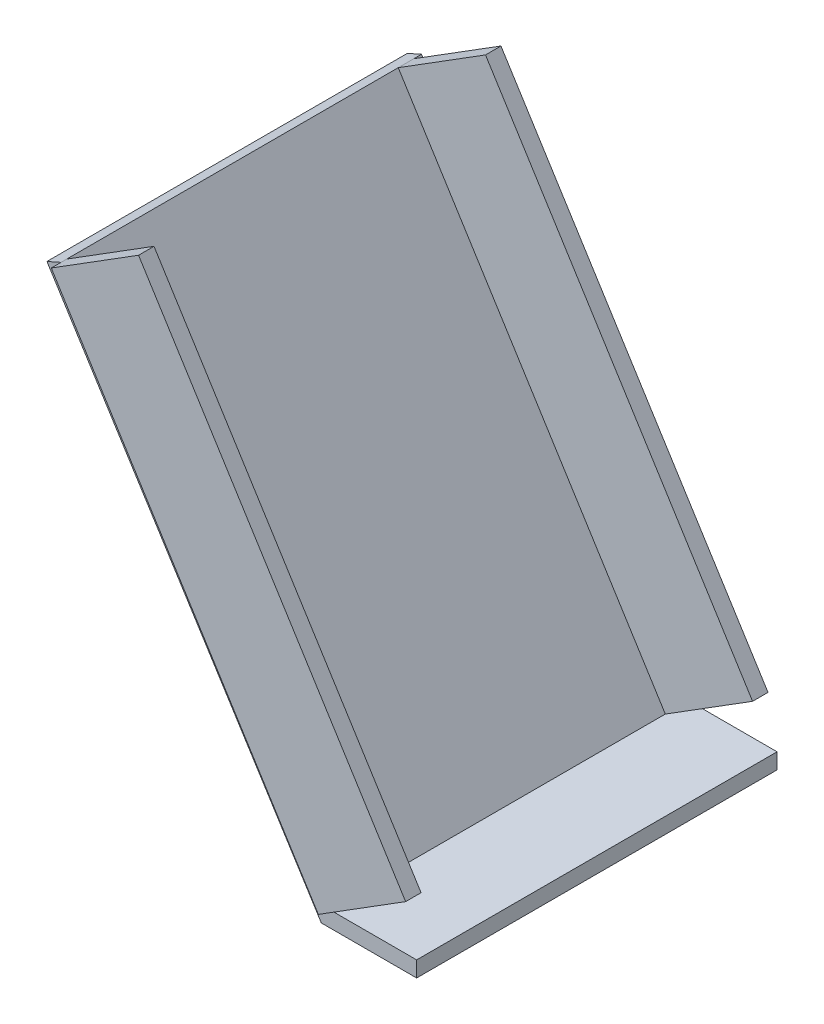
ISO-10303-21;
HEADER;
FILE_DESCRIPTION(('STEP AP214'),'2;1');
FILE_NAME('part.step','',(''),(''),'','','');
FILE_SCHEMA(('AUTOMOTIVE_DESIGN { 1 0 10303 214 1 1 1 1 }'));
ENDSEC;
DATA;
#1=APPLICATION_CONTEXT('core data for automotive mechanical design processes');
#2=APPLICATION_PROTOCOL_DEFINITION('international standard','automotive_design',2000,#1);
#3=PRODUCT_CONTEXT('',#1,'mechanical');
#4=PRODUCT('Part','Part','',(#3));
#5=PRODUCT_RELATED_PRODUCT_CATEGORY('part','',(#4));
#6=PRODUCT_DEFINITION_FORMATION('','',#4);
#7=PRODUCT_DEFINITION_CONTEXT('part definition',#1,'design');
#8=PRODUCT_DEFINITION('design','',#6,#7);
#9=PRODUCT_DEFINITION_SHAPE('','',#8);
#10=(LENGTH_UNIT() NAMED_UNIT(*) SI_UNIT(.MILLI.,.METRE.));
#11=(NAMED_UNIT(*) PLANE_ANGLE_UNIT() SI_UNIT($,.RADIAN.));
#12=(NAMED_UNIT(*) SI_UNIT($,.STERADIAN.) SOLID_ANGLE_UNIT());
#13=UNCERTAINTY_MEASURE_WITH_UNIT(LENGTH_MEASURE(1.E-05),#10,'distance_accuracy_value','');
#14=(GEOMETRIC_REPRESENTATION_CONTEXT(3) GLOBAL_UNCERTAINTY_ASSIGNED_CONTEXT((#13)) GLOBAL_UNIT_ASSIGNED_CONTEXT((#10,
#11,#12)) REPRESENTATION_CONTEXT('',''));
#15=CARTESIAN_POINT('',(0.,0.,0.));
#16=DIRECTION('',(0.,0.,1.));
#17=DIRECTION('',(1.,0.,0.));
#18=AXIS2_PLACEMENT_3D('',#15,#16,#17);
#19=CARTESIAN_POINT('',(-23.9046234506212,43.5266603147119,35.));
#20=DIRECTION('',(-0.847412929359507,-0.530934390630649,0.));
#21=DIRECTION('',(0.530934390630649,-0.847412929359507,0.));
#22=AXIS2_PLACEMENT_3D('',#19,#20,#21);
#23=PLANE('',#22);
#24=DIRECTION('',(0.,0.,-1.));
#25=VECTOR('',#24,1.);
#26=CARTESIAN_POINT('',(-23.9046234506212,43.5266603147119,35.));
#27=LINE('',#26,#25);
#28=CARTESIAN_POINT('',(-23.9046234506212,43.5266603147119,33.8957869223467));
#29=VERTEX_POINT('',#28);
#30=CARTESIAN_POINT('',(-23.9046234506212,43.5266603147119,-30.4874039473786));
#31=VERTEX_POINT('',#30);
#32=EDGE_CURVE('E132',#29,#31,#27,.T.);
#33=ORIENTED_EDGE('',*,*,#32,.F.);
#34=DIRECTION('',(0.530934390630649,-0.847412929359507,0.));
#35=VECTOR('',#34,1.);
#36=CARTESIAN_POINT('',(-23.9046234506212,43.5266603147119,33.8957869223467));
#37=LINE('',#36,#35);
#38=CARTESIAN_POINT('',(27.9636575768819,-39.2591843056558,33.8957869223467));
#39=VERTEX_POINT('',#38);
#40=EDGE_CURVE('E117',#29,#39,#37,.T.);
#41=ORIENTED_EDGE('',*,*,#40,.T.);
#42=DIRECTION('',(0.,0.,-1.));
#43=VECTOR('',#42,1.);
#44=CARTESIAN_POINT('',(27.9636575768819,-39.2591843056558,35.));
#45=LINE('',#44,#43);
#46=CARTESIAN_POINT('',(27.9636575768819,-39.2591843056558,-30.4874039473786));
#47=VERTEX_POINT('',#46);
#48=EDGE_CURVE('E175',#39,#47,#45,.T.);
#49=ORIENTED_EDGE('',*,*,#48,.T.);
#50=DIRECTION('',(-0.530934390630649,0.847412929359507,0.));
#51=VECTOR('',#50,1.);
#52=CARTESIAN_POINT('',(-23.9046234506212,43.5266603147119,-30.4874039473786));
#53=LINE('',#52,#51);
#54=EDGE_CURVE('E203',#31,#47,#53,.F.);
#55=ORIENTED_EDGE('',*,*,#54,.F.);
#56=EDGE_LOOP('',(#33,#41,#49,#55));
#57=FACE_BOUND('',#56,.T.);
#58=ADVANCED_FACE('F39',(#57),#23,.F.);
#59=CARTESIAN_POINT('',(45.1559152474732,-42.3082449165515,35.));
#60=DIRECTION('',(0.,1.,0.));
#61=DIRECTION('',(0.,0.,1.));
#62=AXIS2_PLACEMENT_3D('',#59,#60,#61);
#63=PLANE('',#62);
#64=DIRECTION('',(1.,0.,0.));
#65=VECTOR('',#64,1.);
#66=CARTESIAN_POINT('',(45.1559152474732,-42.3082449165515,-35.));
#67=LINE('',#66,#65);
#68=CARTESIAN_POINT('',(26.646058096482,-42.3082449165515,-35.));
#69=VERTEX_POINT('',#68);
#70=CARTESIAN_POINT('',(45.1559152474732,-42.3082449165515,-35.));
#71=VERTEX_POINT('',#70);
#72=EDGE_CURVE('E153',#69,#71,#67,.T.);
#73=ORIENTED_EDGE('',*,*,#72,.T.);
#74=DIRECTION('',(0.,0.,-1.));
#75=VECTOR('',#74,1.);
#76=CARTESIAN_POINT('',(45.1559152474732,-42.3082449165515,35.));
#77=LINE('',#76,#75);
#78=CARTESIAN_POINT('',(45.1559152474732,-42.3082449165515,35.));
#79=VERTEX_POINT('',#78);
#80=EDGE_CURVE('E11',#79,#71,#77,.T.);
#81=ORIENTED_EDGE('',*,*,#80,.F.);
#82=DIRECTION('',(1.,0.,0.));
#83=VECTOR('',#82,1.);
#84=CARTESIAN_POINT('',(45.1559152474732,-42.3082449165515,35.));
#85=LINE('',#84,#83);
#86=CARTESIAN_POINT('',(26.646058096482,-42.3082449165515,35.));
#87=VERTEX_POINT('',#86);
#88=EDGE_CURVE('E169',#87,#79,#85,.T.);
#89=ORIENTED_EDGE('',*,*,#88,.F.);
#90=DIRECTION('',(0.,0.,-1.));
#91=VECTOR('',#90,1.);
#92=CARTESIAN_POINT('',(26.646058096482,-42.3082449165515,35.));
#93=LINE('',#92,#91);
#94=EDGE_CURVE('E149',#87,#69,#93,.T.);
#95=ORIENTED_EDGE('',*,*,#94,.T.);
#96=EDGE_LOOP('',(#73,#81,#89,#95));
#97=FACE_BOUND('',#96,.T.);
#98=ADVANCED_FACE('F41',(#97),#63,.F.);
#99=CARTESIAN_POINT('',(45.1559152474732,-39.2591843056558,35.));
#100=DIRECTION('',(-1.,0.,0.));
#101=DIRECTION('',(0.,0.,1.));
#102=AXIS2_PLACEMENT_3D('',#99,#100,#101);
#103=PLANE('',#102);
#104=DIRECTION('',(0.,1.,0.));
#105=VECTOR('',#104,1.);
#106=CARTESIAN_POINT('',(45.1559152474732,-39.2591843056558,-35.));
#107=LINE('',#106,#105);
#108=CARTESIAN_POINT('',(45.1559152474732,-39.2591843056558,-35.));
#109=VERTEX_POINT('',#108);
#110=EDGE_CURVE('E156',#71,#109,#107,.T.);
#111=ORIENTED_EDGE('',*,*,#110,.T.);
#112=DIRECTION('',(0.,0.,-1.));
#113=VECTOR('',#112,1.);
#114=CARTESIAN_POINT('',(45.1559152474732,-39.2591843056558,35.));
#115=LINE('',#114,#113);
#116=CARTESIAN_POINT('',(45.1559152474732,-39.2591843056558,35.));
#117=VERTEX_POINT('',#116);
#118=EDGE_CURVE('E50',#117,#109,#115,.T.);
#119=ORIENTED_EDGE('',*,*,#118,.F.);
#120=DIRECTION('',(0.,1.,0.));
#121=VECTOR('',#120,1.);
#122=CARTESIAN_POINT('',(45.1559152474732,-39.2591843056558,35.));
#123=LINE('',#122,#121);
#124=EDGE_CURVE('E98',#79,#117,#123,.T.);
#125=ORIENTED_EDGE('',*,*,#124,.F.);
#126=ORIENTED_EDGE('',*,*,#80,.T.);
#127=EDGE_LOOP('',(#111,#119,#125,#126));
#128=FACE_BOUND('',#127,.T.);
#129=ADVANCED_FACE('F261',(#128),#103,.F.);
#130=CARTESIAN_POINT('',(27.9636575768819,-39.2591843056558,35.));
#131=DIRECTION('',(0.,-1.,0.));
#132=DIRECTION('',(0.,0.,-1.));
#133=AXIS2_PLACEMENT_3D('',#130,#131,#132);
#134=PLANE('',#133);
#135=DIRECTION('',(-1.,0.,0.));
#136=VECTOR('',#135,1.);
#137=CARTESIAN_POINT('',(27.9636575768819,-39.2591843056558,-35.));
#138=LINE('',#137,#136);
#139=CARTESIAN_POINT('',(27.9636575768819,-39.2591843056558,-35.));
#140=VERTEX_POINT('',#139);
#141=EDGE_CURVE('E157',#109,#140,#138,.T.);
#142=ORIENTED_EDGE('',*,*,#141,.T.);
#143=CARTESIAN_POINT('',(27.9636575768819,-39.2591843056558,-33.4874039473786));
#144=VERTEX_POINT('',#143);
#145=EDGE_CURVE('E133',#144,#140,#45,.T.);
#146=ORIENTED_EDGE('',*,*,#145,.F.);
#147=DIRECTION('',(0.,0.,1.));
#148=VECTOR('',#147,1.);
#149=CARTESIAN_POINT('',(27.9636575768819,-39.2591843056558,-33.4874039473786));
#150=LINE('',#149,#148);
#151=EDGE_CURVE('E53',#144,#47,#150,.T.);
#152=ORIENTED_EDGE('',*,*,#151,.T.);
#153=ORIENTED_EDGE('',*,*,#48,.F.);
#154=CARTESIAN_POINT('',(27.9636575768819,-39.2591843056558,35.));
#155=VERTEX_POINT('',#154);
#156=EDGE_CURVE('E174',#155,#39,#45,.T.);
#157=ORIENTED_EDGE('',*,*,#156,.F.);
#158=DIRECTION('',(-1.,0.,0.));
#159=VECTOR('',#158,1.);
#160=CARTESIAN_POINT('',(27.9636575768819,-39.2591843056558,35.));
#161=LINE('',#160,#159);
#162=EDGE_CURVE('E141',#117,#155,#161,.T.);
#163=ORIENTED_EDGE('',*,*,#162,.F.);
#164=ORIENTED_EDGE('',*,*,#118,.T.);
#165=EDGE_LOOP('',(#142,#146,#152,#153,#157,#163,#164));
#166=FACE_BOUND('',#165,.T.);
#167=ADVANCED_FACE('F177',(#166),#134,.F.);
#168=CARTESIAN_POINT('',(-23.9046234506212,43.5266603147119,-33.4874039473786));
#169=VERTEX_POINT('',#168);
#170=CARTESIAN_POINT('',(-23.9046234506212,43.5266603147119,-35.));
#171=VERTEX_POINT('',#170);
#172=EDGE_CURVE('E137',#169,#171,#27,.T.);
#173=ORIENTED_EDGE('',*,*,#172,.F.);
#174=DIRECTION('',(0.530934390630649,-0.847412929359507,0.));
#175=VECTOR('',#174,1.);
#176=CARTESIAN_POINT('',(-23.9046234506212,43.5266603147119,-33.4874039473786));
#177=LINE('',#176,#175);
#178=EDGE_CURVE('E191',#169,#144,#177,.T.);
#179=ORIENTED_EDGE('',*,*,#178,.T.);
#180=ORIENTED_EDGE('',*,*,#145,.T.);
#181=DIRECTION('',(-0.530934390630649,0.847412929359507,0.));
#182=VECTOR('',#181,1.);
#183=CARTESIAN_POINT('',(-23.9046234506212,43.5266603147119,-35.));
#184=LINE('',#183,#182);
#185=EDGE_CURVE('E165',#140,#171,#184,.T.);
#186=ORIENTED_EDGE('',*,*,#185,.T.);
#187=EDGE_LOOP('',(#173,#179,#180,#186));
#188=FACE_BOUND('',#187,.T.);
#189=ADVANCED_FACE('F189',(#188),#23,.F.);
#190=CARTESIAN_POINT('',(-26.646058096482,42.3082449165515,35.));
#191=DIRECTION('',(0.406138466053449,-0.913811548620257,0.));
#192=DIRECTION('',(0.913811548620257,0.406138466053449,0.));
#193=AXIS2_PLACEMENT_3D('',#190,#191,#192);
#194=PLANE('',#193);
#195=DIRECTION('',(-0.913811548620257,-0.406138466053449,0.));
#196=VECTOR('',#195,1.);
#197=CARTESIAN_POINT('',(-26.646058096482,42.3082449165515,-35.));
#198=LINE('',#197,#196);
#199=CARTESIAN_POINT('',(-26.646058096482,42.3082449165515,-35.));
#200=VERTEX_POINT('',#199);
#201=EDGE_CURVE('E164',#171,#200,#198,.T.);
#202=ORIENTED_EDGE('',*,*,#201,.T.);
#203=DIRECTION('',(0.,0.,-1.));
#204=VECTOR('',#203,1.);
#205=CARTESIAN_POINT('',(-26.646058096482,42.3082449165515,35.));
#206=LINE('',#205,#204);
#207=CARTESIAN_POINT('',(-26.646058096482,42.3082449165515,35.));
#208=VERTEX_POINT('',#207);
#209=EDGE_CURVE('E150',#208,#200,#206,.T.);
#210=ORIENTED_EDGE('',*,*,#209,.F.);
#211=DIRECTION('',(-0.913811548620257,-0.406138466053449,0.));
#212=VECTOR('',#211,1.);
#213=CARTESIAN_POINT('',(-26.646058096482,42.3082449165515,35.));
#214=LINE('',#213,#212);
#215=CARTESIAN_POINT('',(-23.9046234506212,43.5266603147119,35.));
#216=VERTEX_POINT('',#215);
#217=EDGE_CURVE('E140',#216,#208,#214,.T.);
#218=ORIENTED_EDGE('',*,*,#217,.F.);
#219=EDGE_CURVE('E123',#216,#29,#27,.T.);
#220=ORIENTED_EDGE('',*,*,#219,.T.);
#221=ORIENTED_EDGE('',*,*,#32,.T.);
#222=DIRECTION('',(0.,0.,-1.));
#223=VECTOR('',#222,1.);
#224=CARTESIAN_POINT('',(-23.9046234506212,43.5266603147119,-30.4874039473786));
#225=LINE('',#224,#223);
#226=EDGE_CURVE('E243',#31,#169,#225,.T.);
#227=ORIENTED_EDGE('',*,*,#226,.T.);
#228=ORIENTED_EDGE('',*,*,#172,.T.);
#229=EDGE_LOOP('',(#202,#210,#218,#220,#221,#227,#228));
#230=FACE_BOUND('',#229,.T.);
#231=ADVANCED_FACE('F148',(#230),#194,.F.);
#232=CARTESIAN_POINT('',(-26.646058096482,42.3082449165515,35.));
#233=DIRECTION('',(0.846164898331031,0.532921161929639,0.));
#234=DIRECTION('',(-0.532921161929639,0.846164898331031,0.));
#235=AXIS2_PLACEMENT_3D('',#232,#233,#234);
#236=PLANE('',#235);
#237=DIRECTION('',(0.532921161929639,-0.846164898331031,0.));
#238=VECTOR('',#237,1.);
#239=CARTESIAN_POINT('',(-26.646058096482,42.3082449165515,-35.));
#240=LINE('',#239,#238);
#241=EDGE_CURVE('E89',#200,#69,#240,.T.);
#242=ORIENTED_EDGE('',*,*,#241,.T.);
#243=ORIENTED_EDGE('',*,*,#94,.F.);
#244=DIRECTION('',(0.532921161929639,-0.846164898331031,0.));
#245=VECTOR('',#244,1.);
#246=CARTESIAN_POINT('',(-26.646058096482,42.3082449165515,35.));
#247=LINE('',#246,#245);
#248=EDGE_CURVE('E65',#208,#87,#247,.T.);
#249=ORIENTED_EDGE('',*,*,#248,.F.);
#250=ORIENTED_EDGE('',*,*,#209,.T.);
#251=EDGE_LOOP('',(#242,#243,#249,#250));
#252=FACE_BOUND('',#251,.T.);
#253=ADVANCED_FACE('F276',(#252),#236,.F.);
#254=CARTESIAN_POINT('',(0.,0.,35.));
#255=DIRECTION('',(0.,0.,1.));
#256=DIRECTION('',(1.,0.,0.));
#257=AXIS2_PLACEMENT_3D('',#254,#255,#256);
#258=PLANE('',#257);
#259=ORIENTED_EDGE('',*,*,#88,.T.);
#260=ORIENTED_EDGE('',*,*,#124,.T.);
#261=ORIENTED_EDGE('',*,*,#162,.T.);
#262=DIRECTION('',(-0.530934390630649,0.847412929359507,0.));
#263=VECTOR('',#262,1.);
#264=CARTESIAN_POINT('',(-23.9046234506212,43.5266603147119,35.));
#265=LINE('',#264,#263);
#266=EDGE_CURVE('E115',#155,#216,#265,.T.);
#267=ORIENTED_EDGE('',*,*,#266,.T.);
#268=ORIENTED_EDGE('',*,*,#217,.T.);
#269=ORIENTED_EDGE('',*,*,#248,.T.);
#270=EDGE_LOOP('',(#259,#260,#261,#267,#268,#269));
#271=FACE_BOUND('',#270,.T.);
#272=ADVANCED_FACE('F138',(#271),#258,.T.);
#273=CARTESIAN_POINT('',(0.,0.,-35.));
#274=DIRECTION('',(0.,0.,1.));
#275=DIRECTION('',(1.,0.,0.));
#276=AXIS2_PLACEMENT_3D('',#273,#274,#275);
#277=PLANE('',#276);
#278=ORIENTED_EDGE('',*,*,#72,.F.);
#279=ORIENTED_EDGE('',*,*,#241,.F.);
#280=ORIENTED_EDGE('',*,*,#201,.F.);
#281=ORIENTED_EDGE('',*,*,#185,.F.);
#282=ORIENTED_EDGE('',*,*,#141,.F.);
#283=ORIENTED_EDGE('',*,*,#110,.F.);
#284=EDGE_LOOP('',(#278,#279,#280,#281,#282,#283));
#285=FACE_BOUND('',#284,.T.);
#286=ADVANCED_FACE('F185',(#285),#277,.F.);
#287=CARTESIAN_POINT('',(-6.95636486343104,54.1453481273249,36.8957869223467));
#288=DIRECTION('',(0.,0.,-1.));
#289=DIRECTION('',(-1.,0.,0.));
#290=AXIS2_PLACEMENT_3D('',#287,#288,#289);
#291=PLANE('',#290);
#292=DIRECTION('',(-0.530934390630649,0.847412929359507,0.));
#293=VECTOR('',#292,1.);
#294=CARTESIAN_POINT('',(-23.9046234506212,43.5266603147119,36.8957869223467));
#295=LINE('',#294,#293);
#296=CARTESIAN_POINT('',(-23.9046234506212,43.5266603147119,36.8957869223467));
#297=VERTEX_POINT('',#296);
#298=CARTESIAN_POINT('',(27.9636575768819,-39.2591843056558,36.8957869223467));
#299=VERTEX_POINT('',#298);
#300=EDGE_CURVE('E119',#297,#299,#295,.F.);
#301=ORIENTED_EDGE('',*,*,#300,.T.);
#302=DIRECTION('',(-0.847412929359507,-0.530934390630649,0.));
#303=VECTOR('',#302,1.);
#304=CARTESIAN_POINT('',(44.911916164072,-28.6404964930428,36.8957869223467));
#305=LINE('',#304,#303);
#306=CARTESIAN_POINT('',(44.911916164072,-28.6404964930428,36.8957869223467));
#307=VERTEX_POINT('',#306);
#308=EDGE_CURVE('E160',#307,#299,#305,.T.);
#309=ORIENTED_EDGE('',*,*,#308,.F.);
#310=DIRECTION('',(-0.530934390630649,0.847412929359507,0.));
#311=VECTOR('',#310,1.);
#312=CARTESIAN_POINT('',(-6.95636486343104,54.1453481273249,36.8957869223467));
#313=LINE('',#312,#311);
#314=CARTESIAN_POINT('',(-6.95636486343104,54.1453481273249,36.8957869223467));
#315=VERTEX_POINT('',#314);
#316=EDGE_CURVE('E118',#315,#307,#313,.F.);
#317=ORIENTED_EDGE('',*,*,#316,.F.);
#318=DIRECTION('',(-0.847412929359507,-0.530934390630649,0.));
#319=VECTOR('',#318,1.);
#320=CARTESIAN_POINT('',(-6.95636486343104,54.1453481273249,36.8957869223467));
#321=LINE('',#320,#319);
#322=EDGE_CURVE('E342',#315,#297,#321,.T.);
#323=ORIENTED_EDGE('',*,*,#322,.T.);
#324=EDGE_LOOP('',(#301,#309,#317,#323));
#325=FACE_BOUND('',#324,.T.);
#326=ADVANCED_FACE('F286',(#325),#291,.F.);
#327=CARTESIAN_POINT('',(44.911916164072,-28.6404964930428,33.8957869223467));
#328=DIRECTION('',(0.530934390630649,-0.847412929359507,0.));
#329=DIRECTION('',(0.847412929359507,0.530934390630649,0.));
#330=AXIS2_PLACEMENT_3D('',#327,#328,#329);
#331=PLANE('',#330);
#332=ORIENTED_EDGE('',*,*,#156,.T.);
#333=DIRECTION('',(-0.847412929359507,-0.530934390630649,0.));
#334=VECTOR('',#333,1.);
#335=CARTESIAN_POINT('',(44.911916164072,-28.6404964930428,33.8957869223467));
#336=LINE('',#335,#334);
#337=CARTESIAN_POINT('',(44.911916164072,-28.6404964930428,33.8957869223467));
#338=VERTEX_POINT('',#337);
#339=EDGE_CURVE('E209',#338,#39,#336,.T.);
#340=ORIENTED_EDGE('',*,*,#339,.F.);
#341=DIRECTION('',(0.,0.,1.));
#342=VECTOR('',#341,1.);
#343=CARTESIAN_POINT('',(44.911916164072,-28.6404964930428,33.8957869223467));
#344=LINE('',#343,#342);
#345=EDGE_CURVE('E329',#338,#307,#344,.T.);
#346=ORIENTED_EDGE('',*,*,#345,.T.);
#347=ORIENTED_EDGE('',*,*,#308,.T.);
#348=DIRECTION('',(0.,0.,1.));
#349=VECTOR('',#348,1.);
#350=CARTESIAN_POINT('',(27.9636575768819,-39.2591843056558,33.8957869223467));
#351=LINE('',#350,#349);
#352=EDGE_CURVE('E343',#155,#299,#351,.T.);
#353=ORIENTED_EDGE('',*,*,#352,.F.);
#354=EDGE_LOOP('',(#332,#340,#346,#347,#353));
#355=FACE_BOUND('',#354,.T.);
#356=ADVANCED_FACE('F305',(#355),#331,.T.);
#357=CARTESIAN_POINT('',(-6.95636486343104,54.1453481273249,33.8957869223467));
#358=DIRECTION('',(0.,0.,-1.));
#359=DIRECTION('',(-1.,0.,0.));
#360=AXIS2_PLACEMENT_3D('',#357,#358,#359);
#361=PLANE('',#360);
#362=ORIENTED_EDGE('',*,*,#40,.F.);
#363=DIRECTION('',(-0.847412929359507,-0.530934390630649,0.));
#364=VECTOR('',#363,1.);
#365=CARTESIAN_POINT('',(-6.95636486343104,54.1453481273249,33.8957869223467));
#366=LINE('',#365,#364);
#367=CARTESIAN_POINT('',(-6.95636486343104,54.1453481273249,33.8957869223467));
#368=VERTEX_POINT('',#367);
#369=EDGE_CURVE('E129',#368,#29,#366,.T.);
#370=ORIENTED_EDGE('',*,*,#369,.F.);
#371=DIRECTION('',(0.530934390630649,-0.847412929359507,0.));
#372=VECTOR('',#371,1.);
#373=CARTESIAN_POINT('',(-6.95636486343104,54.1453481273249,33.8957869223467));
#374=LINE('',#373,#372);
#375=EDGE_CURVE('E336',#368,#338,#374,.T.);
#376=ORIENTED_EDGE('',*,*,#375,.T.);
#377=ORIENTED_EDGE('',*,*,#339,.T.);
#378=EDGE_LOOP('',(#362,#370,#376,#377));
#379=FACE_BOUND('',#378,.T.);
#380=ADVANCED_FACE('F310',(#379),#361,.T.);
#381=CARTESIAN_POINT('',(-6.95636486343104,54.1453481273249,36.8957869223467));
#382=DIRECTION('',(-0.530934390630649,0.847412929359507,0.));
#383=DIRECTION('',(-0.847412929359507,-0.530934390630649,0.));
#384=AXIS2_PLACEMENT_3D('',#381,#382,#383);
#385=PLANE('',#384);
#386=DIRECTION('',(0.,0.,-1.));
#387=VECTOR('',#386,1.);
#388=CARTESIAN_POINT('',(-23.9046234506212,43.5266603147119,36.8957869223467));
#389=LINE('',#388,#387);
#390=EDGE_CURVE('E110',#297,#216,#389,.T.);
#391=ORIENTED_EDGE('',*,*,#390,.F.);
#392=ORIENTED_EDGE('',*,*,#322,.F.);
#393=DIRECTION('',(0.,0.,-1.));
#394=VECTOR('',#393,1.);
#395=CARTESIAN_POINT('',(-6.95636486343104,54.1453481273249,36.8957869223467));
#396=LINE('',#395,#394);
#397=EDGE_CURVE('E335',#315,#368,#396,.T.);
#398=ORIENTED_EDGE('',*,*,#397,.T.);
#399=ORIENTED_EDGE('',*,*,#369,.T.);
#400=ORIENTED_EDGE('',*,*,#219,.F.);
#401=EDGE_LOOP('',(#391,#392,#398,#399,#400));
#402=FACE_BOUND('',#401,.T.);
#403=ADVANCED_FACE('F125',(#402),#385,.T.);
#404=CARTESIAN_POINT('',(19.3656852186719,12.1332917217723,0.));
#405=DIRECTION('',(0.847412929359507,0.530934390630649,0.));
#406=DIRECTION('',(0.,0.,-1.));
#407=AXIS2_PLACEMENT_3D('',#404,#405,#406);
#408=PLANE('',#407);
#409=ORIENTED_EDGE('',*,*,#316,.T.);
#410=ORIENTED_EDGE('',*,*,#345,.F.);
#411=ORIENTED_EDGE('',*,*,#375,.F.);
#412=ORIENTED_EDGE('',*,*,#397,.F.);
#413=EDGE_LOOP('',(#409,#410,#411,#412));
#414=FACE_BOUND('',#413,.T.);
#415=ADVANCED_FACE('F312',(#414),#408,.T.);
#416=CARTESIAN_POINT('',(2.41742663148176,1.51460390915933,0.));
#417=DIRECTION('',(0.847412929359507,0.530934390630649,0.));
#418=DIRECTION('',(0.,0.,-1.));
#419=AXIS2_PLACEMENT_3D('',#416,#417,#418);
#420=PLANE('',#419);
#421=ORIENTED_EDGE('',*,*,#266,.F.);
#422=ORIENTED_EDGE('',*,*,#352,.T.);
#423=ORIENTED_EDGE('',*,*,#300,.F.);
#424=ORIENTED_EDGE('',*,*,#390,.T.);
#425=EDGE_LOOP('',(#421,#422,#423,#424));
#426=FACE_BOUND('',#425,.T.);
#427=ADVANCED_FACE('F108',(#426),#420,.F.);
#428=CARTESIAN_POINT('',(-6.95636486343104,54.1453481273249,-30.4874039473786));
#429=DIRECTION('',(0.,0.,-1.));
#430=DIRECTION('',(-1.,0.,0.));
#431=AXIS2_PLACEMENT_3D('',#428,#429,#430);
#432=PLANE('',#431);
#433=ORIENTED_EDGE('',*,*,#54,.T.);
#434=DIRECTION('',(-0.847412929359507,-0.530934390630649,0.));
#435=VECTOR('',#434,1.);
#436=CARTESIAN_POINT('',(44.911916164072,-28.6404964930428,-30.4874039473786));
#437=LINE('',#436,#435);
#438=CARTESIAN_POINT('',(44.911916164072,-28.6404964930428,-30.4874039473786));
#439=VERTEX_POINT('',#438);
#440=EDGE_CURVE('E254',#439,#47,#437,.T.);
#441=ORIENTED_EDGE('',*,*,#440,.F.);
#442=DIRECTION('',(-0.530934390630649,0.847412929359507,0.));
#443=VECTOR('',#442,1.);
#444=CARTESIAN_POINT('',(-6.95636486343104,54.1453481273249,-30.4874039473786));
#445=LINE('',#444,#443);
#446=CARTESIAN_POINT('',(-6.95636486343104,54.1453481273249,-30.4874039473786));
#447=VERTEX_POINT('',#446);
#448=EDGE_CURVE('E240',#447,#439,#445,.F.);
#449=ORIENTED_EDGE('',*,*,#448,.F.);
#450=DIRECTION('',(-0.847412929359507,-0.530934390630649,0.));
#451=VECTOR('',#450,1.);
#452=CARTESIAN_POINT('',(-6.95636486343104,54.1453481273249,-30.4874039473786));
#453=LINE('',#452,#451);
#454=EDGE_CURVE('E234',#447,#31,#453,.T.);
#455=ORIENTED_EDGE('',*,*,#454,.T.);
#456=EDGE_LOOP('',(#433,#441,#449,#455));
#457=FACE_BOUND('',#456,.T.);
#458=ADVANCED_FACE('F235',(#457),#432,.F.);
#459=CARTESIAN_POINT('',(44.911916164072,-28.6404964930428,-33.4874039473786));
#460=DIRECTION('',(0.530934390630649,-0.847412929359507,0.));
#461=DIRECTION('',(0.847412929359507,0.530934390630649,0.));
#462=AXIS2_PLACEMENT_3D('',#459,#460,#461);
#463=PLANE('',#462);
#464=ORIENTED_EDGE('',*,*,#151,.F.);
#465=DIRECTION('',(-0.847412929359507,-0.530934390630649,0.));
#466=VECTOR('',#465,1.);
#467=CARTESIAN_POINT('',(44.911916164072,-28.6404964930428,-33.4874039473786));
#468=LINE('',#467,#466);
#469=CARTESIAN_POINT('',(44.911916164072,-28.6404964930428,-33.4874039473786));
#470=VERTEX_POINT('',#469);
#471=EDGE_CURVE('E251',#470,#144,#468,.T.);
#472=ORIENTED_EDGE('',*,*,#471,.F.);
#473=DIRECTION('',(0.,0.,1.));
#474=VECTOR('',#473,1.);
#475=CARTESIAN_POINT('',(44.911916164072,-28.6404964930428,-33.4874039473786));
#476=LINE('',#475,#474);
#477=EDGE_CURVE('E247',#470,#439,#476,.T.);
#478=ORIENTED_EDGE('',*,*,#477,.T.);
#479=ORIENTED_EDGE('',*,*,#440,.T.);
#480=EDGE_LOOP('',(#464,#472,#478,#479));
#481=FACE_BOUND('',#480,.T.);
#482=ADVANCED_FACE('F290',(#481),#463,.T.);
#483=CARTESIAN_POINT('',(-6.95636486343104,54.1453481273249,-33.4874039473786));
#484=DIRECTION('',(0.,0.,-1.));
#485=DIRECTION('',(-1.,0.,0.));
#486=AXIS2_PLACEMENT_3D('',#483,#484,#485);
#487=PLANE('',#486);
#488=ORIENTED_EDGE('',*,*,#178,.F.);
#489=DIRECTION('',(-0.847412929359507,-0.530934390630649,0.));
#490=VECTOR('',#489,1.);
#491=CARTESIAN_POINT('',(-6.95636486343104,54.1453481273249,-33.4874039473786));
#492=LINE('',#491,#490);
#493=CARTESIAN_POINT('',(-6.95636486343104,54.1453481273249,-33.4874039473786));
#494=VERTEX_POINT('',#493);
#495=EDGE_CURVE('E244',#494,#169,#492,.T.);
#496=ORIENTED_EDGE('',*,*,#495,.F.);
#497=DIRECTION('',(0.530934390630649,-0.847412929359507,0.));
#498=VECTOR('',#497,1.);
#499=CARTESIAN_POINT('',(-6.95636486343104,54.1453481273249,-33.4874039473786));
#500=LINE('',#499,#498);
#501=EDGE_CURVE('E351',#494,#470,#500,.T.);
#502=ORIENTED_EDGE('',*,*,#501,.T.);
#503=ORIENTED_EDGE('',*,*,#471,.T.);
#504=EDGE_LOOP('',(#488,#496,#502,#503));
#505=FACE_BOUND('',#504,.T.);
#506=ADVANCED_FACE('F291',(#505),#487,.T.);
#507=CARTESIAN_POINT('',(-6.95636486343104,54.1453481273249,-30.4874039473786));
#508=DIRECTION('',(-0.530934390630649,0.847412929359507,0.));
#509=DIRECTION('',(-0.847412929359507,-0.530934390630649,0.));
#510=AXIS2_PLACEMENT_3D('',#507,#508,#509);
#511=PLANE('',#510);
#512=ORIENTED_EDGE('',*,*,#226,.F.);
#513=ORIENTED_EDGE('',*,*,#454,.F.);
#514=DIRECTION('',(0.,0.,-1.));
#515=VECTOR('',#514,1.);
#516=CARTESIAN_POINT('',(-6.95636486343104,54.1453481273249,-30.4874039473786));
#517=LINE('',#516,#515);
#518=EDGE_CURVE('E241',#447,#494,#517,.T.);
#519=ORIENTED_EDGE('',*,*,#518,.T.);
#520=ORIENTED_EDGE('',*,*,#495,.T.);
#521=EDGE_LOOP('',(#512,#513,#519,#520));
#522=FACE_BOUND('',#521,.T.);
#523=ADVANCED_FACE('F242',(#522),#511,.T.);
#524=CARTESIAN_POINT('',(19.3656852186719,12.1332917217723,0.));
#525=DIRECTION('',(0.847412929359507,0.530934390630649,0.));
#526=DIRECTION('',(0.,0.,-1.));
#527=AXIS2_PLACEMENT_3D('',#524,#525,#526);
#528=PLANE('',#527);
#529=ORIENTED_EDGE('',*,*,#448,.T.);
#530=ORIENTED_EDGE('',*,*,#477,.F.);
#531=ORIENTED_EDGE('',*,*,#501,.F.);
#532=ORIENTED_EDGE('',*,*,#518,.F.);
#533=EDGE_LOOP('',(#529,#530,#531,#532));
#534=FACE_BOUND('',#533,.T.);
#535=ADVANCED_FACE('F298',(#534),#528,.T.);
#536=CLOSED_SHELL('',(#58,#98,#129,#167,#189,#231,#253,#272,#286,#326,#356,#380,#403,#415,#427,
#458,#482,#506,#523,#535));
#537=MANIFOLD_SOLID_BREP('B2',#536);
#538=ADVANCED_BREP_SHAPE_REPRESENTATION('',(#18,#537),#14);
#539=SHAPE_DEFINITION_REPRESENTATION(#9,#538);
ENDSEC;
END-ISO-10303-21;
